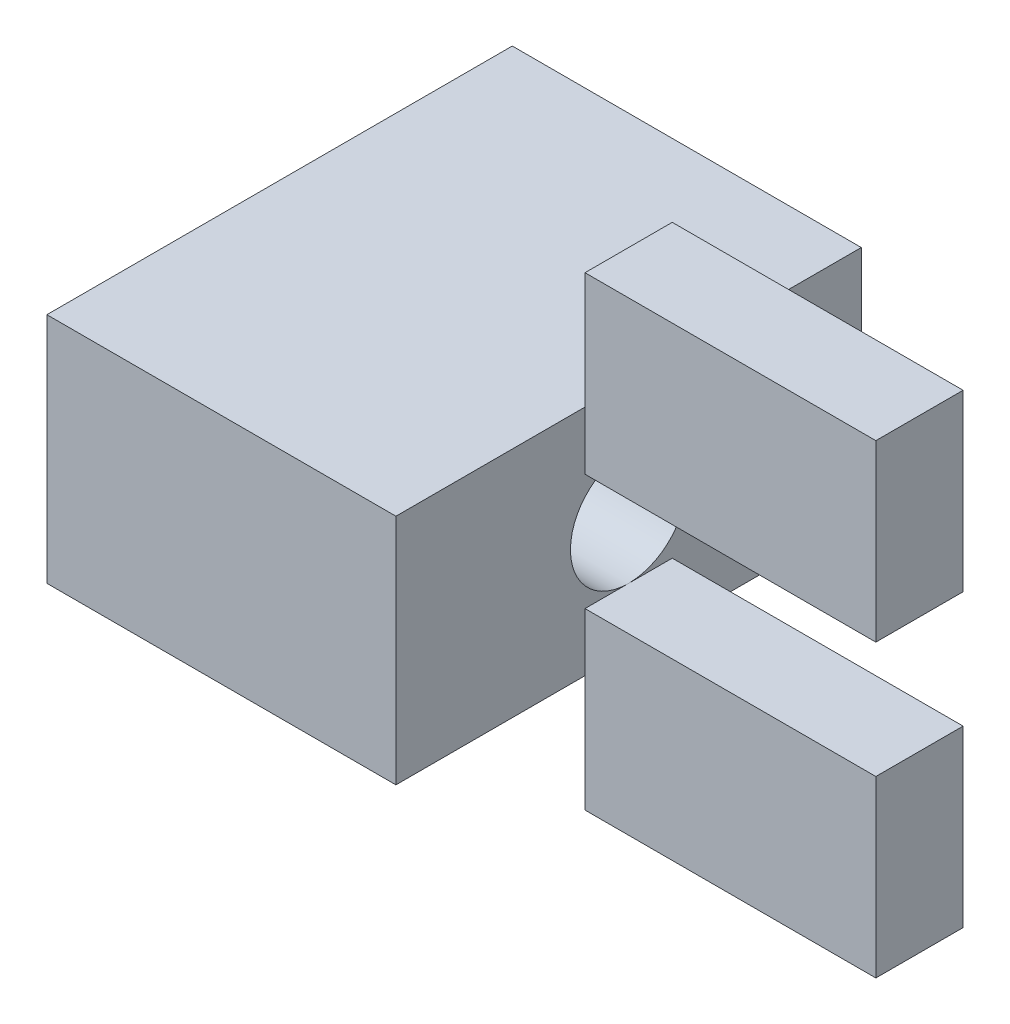
ISO-10303-21;
HEADER;
FILE_DESCRIPTION(('STEP AP214'),'2;1');
FILE_NAME('part.step','',(''),(''),'','','');
FILE_SCHEMA(('AUTOMOTIVE_DESIGN { 1 0 10303 214 1 1 1 1 }'));
ENDSEC;
DATA;
#1=APPLICATION_CONTEXT('core data for automotive mechanical design processes');
#2=APPLICATION_PROTOCOL_DEFINITION('international standard','automotive_design',2000,#1);
#3=PRODUCT_CONTEXT('',#1,'mechanical');
#4=PRODUCT('Part','Part','',(#3));
#5=PRODUCT_RELATED_PRODUCT_CATEGORY('part','',(#4));
#6=PRODUCT_DEFINITION_FORMATION('','',#4);
#7=PRODUCT_DEFINITION_CONTEXT('part definition',#1,'design');
#8=PRODUCT_DEFINITION('design','',#6,#7);
#9=PRODUCT_DEFINITION_SHAPE('','',#8);
#10=(LENGTH_UNIT() NAMED_UNIT(*) SI_UNIT(.MILLI.,.METRE.));
#11=(NAMED_UNIT(*) PLANE_ANGLE_UNIT() SI_UNIT($,.RADIAN.));
#12=(NAMED_UNIT(*) SI_UNIT($,.STERADIAN.) SOLID_ANGLE_UNIT());
#13=UNCERTAINTY_MEASURE_WITH_UNIT(LENGTH_MEASURE(1.E-05),#10,'distance_accuracy_value','');
#14=(GEOMETRIC_REPRESENTATION_CONTEXT(3) GLOBAL_UNCERTAINTY_ASSIGNED_CONTEXT((#13)) GLOBAL_UNIT_ASSIGNED_CONTEXT((#10,
#11,#12)) REPRESENTATION_CONTEXT('',''));
#15=CARTESIAN_POINT('',(0.,0.,0.));
#16=DIRECTION('',(0.,0.,1.));
#17=DIRECTION('',(1.,0.,0.));
#18=AXIS2_PLACEMENT_3D('',#15,#16,#17);
#19=CARTESIAN_POINT('',(60.,0.,0.));
#20=DIRECTION('',(-1.,0.,0.));
#21=DIRECTION('',(0.,0.,1.));
#22=AXIS2_PLACEMENT_3D('',#19,#20,#21);
#23=PLANE('',#22);
#24=DIRECTION('',(0.,1.,0.));
#25=VECTOR('',#24,1.);
#26=CARTESIAN_POINT('',(60.,10.,-7.5));
#27=LINE('',#26,#25);
#28=CARTESIAN_POINT('',(60.,10.,-7.5));
#29=VERTEX_POINT('',#28);
#30=CARTESIAN_POINT('',(60.,20.,-7.5));
#31=VERTEX_POINT('',#30);
#32=EDGE_CURVE('E60',#29,#31,#27,.T.);
#33=ORIENTED_EDGE('',*,*,#32,.F.);
#34=DIRECTION('',(0.,0.,-1.));
#35=VECTOR('',#34,1.);
#36=CARTESIAN_POINT('',(60.,10.,7.5));
#37=LINE('',#36,#35);
#38=CARTESIAN_POINT('',(60.,10.,0.));
#39=VERTEX_POINT('',#38);
#40=EDGE_CURVE('E11',#39,#29,#37,.T.);
#41=ORIENTED_EDGE('',*,*,#40,.F.);
#42=CARTESIAN_POINT('',(60.,0.,0.));
#43=DIRECTION('',(1.,0.,0.));
#44=DIRECTION('',(0.,0.,-1.));
#45=AXIS2_PLACEMENT_3D('',#42,#43,#44);
#46=CIRCLE('',#45,10.);
#47=CARTESIAN_POINT('',(60.,-10.,0.));
#48=VERTEX_POINT('',#47);
#49=EDGE_CURVE('E178',#48,#39,#46,.T.);
#50=ORIENTED_EDGE('',*,*,#49,.F.);
#51=DIRECTION('',(0.,0.,1.));
#52=VECTOR('',#51,1.);
#53=CARTESIAN_POINT('',(60.,-10.,7.5));
#54=LINE('',#53,#52);
#55=CARTESIAN_POINT('',(60.,-10.,-7.5));
#56=VERTEX_POINT('',#55);
#57=EDGE_CURVE('E62',#56,#48,#54,.T.);
#58=ORIENTED_EDGE('',*,*,#57,.F.);
#59=DIRECTION('',(0.,1.,0.));
#60=VECTOR('',#59,1.);
#61=CARTESIAN_POINT('',(60.,-40.,-7.5));
#62=LINE('',#61,#60);
#63=CARTESIAN_POINT('',(60.,-20.,-7.5));
#64=VERTEX_POINT('',#63);
#65=EDGE_CURVE('E210',#64,#56,#62,.T.);
#66=ORIENTED_EDGE('',*,*,#65,.F.);
#67=DIRECTION('',(0.,0.,-1.));
#68=VECTOR('',#67,1.);
#69=CARTESIAN_POINT('',(60.,-20.,40.));
#70=LINE('',#69,#68);
#71=CARTESIAN_POINT('',(60.,-20.,-40.));
#72=VERTEX_POINT('',#71);
#73=EDGE_CURVE('E230',#64,#72,#70,.T.);
#74=ORIENTED_EDGE('',*,*,#73,.T.);
#75=DIRECTION('',(0.,1.,0.));
#76=VECTOR('',#75,1.);
#77=CARTESIAN_POINT('',(60.,-20.,-40.));
#78=LINE('',#77,#76);
#79=CARTESIAN_POINT('',(60.,20.,-40.));
#80=VERTEX_POINT('',#79);
#81=EDGE_CURVE('E218',#72,#80,#78,.T.);
#82=ORIENTED_EDGE('',*,*,#81,.T.);
#83=DIRECTION('',(0.,0.,1.));
#84=VECTOR('',#83,1.);
#85=CARTESIAN_POINT('',(60.,20.,40.));
#86=LINE('',#85,#84);
#87=EDGE_CURVE('E221',#80,#31,#86,.T.);
#88=ORIENTED_EDGE('',*,*,#87,.T.);
#89=EDGE_LOOP('',(#33,#41,#50,#58,#66,#74,#82,#88));
#90=FACE_BOUND('',#89,.T.);
#91=ADVANCED_FACE('F39',(#90),#23,.F.);
#92=CARTESIAN_POINT('',(60.,10.,7.5));
#93=VERTEX_POINT('',#92);
#94=EDGE_CURVE('E49',#93,#39,#37,.T.);
#95=ORIENTED_EDGE('',*,*,#94,.F.);
#96=DIRECTION('',(0.,-1.,0.));
#97=VECTOR('',#96,1.);
#98=CARTESIAN_POINT('',(60.,10.,7.5));
#99=LINE('',#98,#97);
#100=CARTESIAN_POINT('',(60.,20.,7.5));
#101=VERTEX_POINT('',#100);
#102=EDGE_CURVE('E48',#101,#93,#99,.T.);
#103=ORIENTED_EDGE('',*,*,#102,.F.);
#104=CARTESIAN_POINT('',(60.,20.,40.));
#105=VERTEX_POINT('',#104);
#106=EDGE_CURVE('E225',#101,#105,#86,.T.);
#107=ORIENTED_EDGE('',*,*,#106,.T.);
#108=DIRECTION('',(0.,-1.,0.));
#109=VECTOR('',#108,1.);
#110=CARTESIAN_POINT('',(60.,-20.,40.));
#111=LINE('',#110,#109);
#112=CARTESIAN_POINT('',(60.,-20.,40.));
#113=VERTEX_POINT('',#112);
#114=EDGE_CURVE('E228',#105,#113,#111,.T.);
#115=ORIENTED_EDGE('',*,*,#114,.T.);
#116=CARTESIAN_POINT('',(60.,-20.,7.5));
#117=VERTEX_POINT('',#116);
#118=EDGE_CURVE('E226',#113,#117,#70,.T.);
#119=ORIENTED_EDGE('',*,*,#118,.T.);
#120=DIRECTION('',(0.,-1.,0.));
#121=VECTOR('',#120,1.);
#122=CARTESIAN_POINT('',(60.,-40.,7.5));
#123=LINE('',#122,#121);
#124=CARTESIAN_POINT('',(60.,-10.,7.5));
#125=VERTEX_POINT('',#124);
#126=EDGE_CURVE('E200',#125,#117,#123,.T.);
#127=ORIENTED_EDGE('',*,*,#126,.F.);
#128=EDGE_CURVE('E204',#48,#125,#54,.T.);
#129=ORIENTED_EDGE('',*,*,#128,.F.);
#130=EDGE_CURVE('E214',#39,#48,#46,.T.);
#131=ORIENTED_EDGE('',*,*,#130,.F.);
#132=EDGE_LOOP('',(#95,#103,#107,#115,#119,#127,#129,#131));
#133=FACE_BOUND('',#132,.T.);
#134=ADVANCED_FACE('F281',(#133),#23,.F.);
#135=CARTESIAN_POINT('',(60.,-20.,-40.));
#136=DIRECTION('',(0.,0.,1.));
#137=DIRECTION('',(1.,0.,0.));
#138=AXIS2_PLACEMENT_3D('',#135,#136,#137);
#139=PLANE('',#138);
#140=DIRECTION('',(0.,1.,0.));
#141=VECTOR('',#140,1.);
#142=CARTESIAN_POINT('',(0.,-20.,-40.));
#143=LINE('',#142,#141);
#144=CARTESIAN_POINT('',(0.,-20.,-40.));
#145=VERTEX_POINT('',#144);
#146=CARTESIAN_POINT('',(0.,20.,-40.));
#147=VERTEX_POINT('',#146);
#148=EDGE_CURVE('E220',#145,#147,#143,.T.);
#149=ORIENTED_EDGE('',*,*,#148,.T.);
#150=DIRECTION('',(-1.,0.,0.));
#151=VECTOR('',#150,1.);
#152=CARTESIAN_POINT('',(60.,20.,-40.));
#153=LINE('',#152,#151);
#154=EDGE_CURVE('E43',#80,#147,#153,.T.);
#155=ORIENTED_EDGE('',*,*,#154,.F.);
#156=ORIENTED_EDGE('',*,*,#81,.F.);
#157=DIRECTION('',(-1.,0.,0.));
#158=VECTOR('',#157,1.);
#159=CARTESIAN_POINT('',(60.,-20.,-40.));
#160=LINE('',#159,#158);
#161=EDGE_CURVE('E232',#72,#145,#160,.T.);
#162=ORIENTED_EDGE('',*,*,#161,.T.);
#163=EDGE_LOOP('',(#149,#155,#156,#162));
#164=FACE_BOUND('',#163,.T.);
#165=ADVANCED_FACE('F41',(#164),#139,.F.);
#166=CARTESIAN_POINT('',(60.,20.,40.));
#167=DIRECTION('',(0.,-1.,0.));
#168=DIRECTION('',(0.,0.,-1.));
#169=AXIS2_PLACEMENT_3D('',#166,#167,#168);
#170=PLANE('',#169);
#171=DIRECTION('',(0.,0.,1.));
#172=VECTOR('',#171,1.);
#173=CARTESIAN_POINT('',(0.,20.,40.));
#174=LINE('',#173,#172);
#175=CARTESIAN_POINT('',(0.,20.,40.));
#176=VERTEX_POINT('',#175);
#177=EDGE_CURVE('E240',#147,#176,#174,.T.);
#178=ORIENTED_EDGE('',*,*,#177,.T.);
#179=DIRECTION('',(-1.,0.,0.));
#180=VECTOR('',#179,1.);
#181=CARTESIAN_POINT('',(60.,20.,40.));
#182=LINE('',#181,#180);
#183=EDGE_CURVE('E248',#105,#176,#182,.T.);
#184=ORIENTED_EDGE('',*,*,#183,.F.);
#185=ORIENTED_EDGE('',*,*,#106,.F.);
#186=EDGE_CURVE('E229',#31,#101,#86,.T.);
#187=ORIENTED_EDGE('',*,*,#186,.F.);
#188=ORIENTED_EDGE('',*,*,#87,.F.);
#189=ORIENTED_EDGE('',*,*,#154,.T.);
#190=EDGE_LOOP('',(#178,#184,#185,#187,#188,#189));
#191=FACE_BOUND('',#190,.T.);
#192=ADVANCED_FACE('F326',(#191),#170,.F.);
#193=CARTESIAN_POINT('',(60.,-20.,40.));
#194=DIRECTION('',(0.,0.,-1.));
#195=DIRECTION('',(-1.,0.,0.));
#196=AXIS2_PLACEMENT_3D('',#193,#194,#195);
#197=PLANE('',#196);
#198=DIRECTION('',(0.,-1.,0.));
#199=VECTOR('',#198,1.);
#200=CARTESIAN_POINT('',(0.,-20.,40.));
#201=LINE('',#200,#199);
#202=CARTESIAN_POINT('',(0.,-20.,40.));
#203=VERTEX_POINT('',#202);
#204=EDGE_CURVE('E239',#176,#203,#201,.T.);
#205=ORIENTED_EDGE('',*,*,#204,.T.);
#206=DIRECTION('',(-1.,0.,0.));
#207=VECTOR('',#206,1.);
#208=CARTESIAN_POINT('',(60.,-20.,40.));
#209=LINE('',#208,#207);
#210=EDGE_CURVE('E245',#113,#203,#209,.T.);
#211=ORIENTED_EDGE('',*,*,#210,.F.);
#212=ORIENTED_EDGE('',*,*,#114,.F.);
#213=ORIENTED_EDGE('',*,*,#183,.T.);
#214=EDGE_LOOP('',(#205,#211,#212,#213));
#215=FACE_BOUND('',#214,.T.);
#216=ADVANCED_FACE('F323',(#215),#197,.F.);
#217=CARTESIAN_POINT('',(60.,-20.,40.));
#218=DIRECTION('',(0.,1.,0.));
#219=DIRECTION('',(0.,0.,1.));
#220=AXIS2_PLACEMENT_3D('',#217,#218,#219);
#221=PLANE('',#220);
#222=DIRECTION('',(0.,0.,-1.));
#223=VECTOR('',#222,1.);
#224=CARTESIAN_POINT('',(0.,-20.,40.));
#225=LINE('',#224,#223);
#226=EDGE_CURVE('E224',#203,#145,#225,.T.);
#227=ORIENTED_EDGE('',*,*,#226,.T.);
#228=ORIENTED_EDGE('',*,*,#161,.F.);
#229=ORIENTED_EDGE('',*,*,#73,.F.);
#230=EDGE_CURVE('E235',#117,#64,#70,.T.);
#231=ORIENTED_EDGE('',*,*,#230,.F.);
#232=ORIENTED_EDGE('',*,*,#118,.F.);
#233=ORIENTED_EDGE('',*,*,#210,.T.);
#234=EDGE_LOOP('',(#227,#228,#229,#231,#232,#233));
#235=FACE_BOUND('',#234,.T.);
#236=ADVANCED_FACE('F317',(#235),#221,.F.);
#237=CARTESIAN_POINT('',(0.,0.,0.));
#238=DIRECTION('',(-1.,0.,0.));
#239=DIRECTION('',(0.,0.,1.));
#240=AXIS2_PLACEMENT_3D('',#237,#238,#239);
#241=PLANE('',#240);
#242=CARTESIAN_POINT('',(0.,0.,0.));
#243=DIRECTION('',(1.,0.,0.));
#244=DIRECTION('',(0.,0.,-1.));
#245=AXIS2_PLACEMENT_3D('',#242,#243,#244);
#246=CIRCLE('',#245,10.);
#247=CARTESIAN_POINT('',(0.,0.,-10.));
#248=VERTEX_POINT('',#247);
#249=EDGE_CURVE('E172',#248,#248,#246,.T.);
#250=ORIENTED_EDGE('',*,*,#249,.T.);
#251=EDGE_LOOP('',(#250));
#252=FACE_BOUND('',#251,.T.);
#253=ORIENTED_EDGE('',*,*,#148,.F.);
#254=ORIENTED_EDGE('',*,*,#226,.F.);
#255=ORIENTED_EDGE('',*,*,#204,.F.);
#256=ORIENTED_EDGE('',*,*,#177,.F.);
#257=EDGE_LOOP('',(#253,#254,#255,#256));
#258=FACE_BOUND('',#257,.T.);
#259=ADVANCED_FACE('F307',(#252,#258),#241,.T.);
#260=CARTESIAN_POINT('',(60.,0.,0.));
#261=DIRECTION('',(-1.,0.,0.));
#262=DIRECTION('',(0.,0.,1.));
#263=AXIS2_PLACEMENT_3D('',#260,#261,#262);
#264=CYLINDRICAL_SURFACE('',#263,10.);
#265=ORIENTED_EDGE('',*,*,#130,.T.);
#266=ORIENTED_EDGE('',*,*,#49,.T.);
#267=EDGE_LOOP('',(#265,#266));
#268=FACE_BOUND('',#267,.T.);
#269=ORIENTED_EDGE('',*,*,#249,.F.);
#270=EDGE_LOOP('',(#269));
#271=FACE_BOUND('',#270,.T.);
#272=ADVANCED_FACE('F284',(#268,#271),#264,.F.);
#273=CARTESIAN_POINT('',(110.,-40.,-7.5));
#274=DIRECTION('',(0.,0.,1.));
#275=DIRECTION('',(1.,0.,0.));
#276=AXIS2_PLACEMENT_3D('',#273,#274,#275);
#277=PLANE('',#276);
#278=CARTESIAN_POINT('',(60.,-40.,-7.5));
#279=VERTEX_POINT('',#278);
#280=EDGE_CURVE('E201',#279,#64,#62,.T.);
#281=ORIENTED_EDGE('',*,*,#280,.T.);
#282=ORIENTED_EDGE('',*,*,#65,.T.);
#283=DIRECTION('',(-1.,0.,0.));
#284=VECTOR('',#283,1.);
#285=CARTESIAN_POINT('',(110.,-10.,-7.5));
#286=LINE('',#285,#284);
#287=CARTESIAN_POINT('',(110.,-10.,-7.5));
#288=VERTEX_POINT('',#287);
#289=EDGE_CURVE('E185',#288,#56,#286,.T.);
#290=ORIENTED_EDGE('',*,*,#289,.F.);
#291=DIRECTION('',(0.,1.,0.));
#292=VECTOR('',#291,1.);
#293=CARTESIAN_POINT('',(110.,-40.,-7.5));
#294=LINE('',#293,#292);
#295=CARTESIAN_POINT('',(110.,-40.,-7.5));
#296=VERTEX_POINT('',#295);
#297=EDGE_CURVE('E196',#296,#288,#294,.T.);
#298=ORIENTED_EDGE('',*,*,#297,.F.);
#299=DIRECTION('',(-1.,0.,0.));
#300=VECTOR('',#299,1.);
#301=CARTESIAN_POINT('',(110.,-40.,-7.5));
#302=LINE('',#301,#300);
#303=EDGE_CURVE('E193',#296,#279,#302,.T.);
#304=ORIENTED_EDGE('',*,*,#303,.T.);
#305=EDGE_LOOP('',(#281,#282,#290,#298,#304));
#306=FACE_BOUND('',#305,.T.);
#307=ADVANCED_FACE('F297',(#306),#277,.F.);
#308=CARTESIAN_POINT('',(110.,-10.,7.5));
#309=DIRECTION('',(0.,-1.,0.));
#310=DIRECTION('',(0.,0.,-1.));
#311=AXIS2_PLACEMENT_3D('',#308,#309,#310);
#312=PLANE('',#311);
#313=ORIENTED_EDGE('',*,*,#57,.T.);
#314=ORIENTED_EDGE('',*,*,#128,.T.);
#315=DIRECTION('',(-1.,0.,0.));
#316=VECTOR('',#315,1.);
#317=CARTESIAN_POINT('',(110.,-10.,7.5));
#318=LINE('',#317,#316);
#319=CARTESIAN_POINT('',(110.,-10.,7.5));
#320=VERTEX_POINT('',#319);
#321=EDGE_CURVE('E183',#320,#125,#318,.T.);
#322=ORIENTED_EDGE('',*,*,#321,.F.);
#323=DIRECTION('',(0.,0.,1.));
#324=VECTOR('',#323,1.);
#325=CARTESIAN_POINT('',(110.,-10.,7.5));
#326=LINE('',#325,#324);
#327=EDGE_CURVE('E211',#288,#320,#326,.T.);
#328=ORIENTED_EDGE('',*,*,#327,.F.);
#329=ORIENTED_EDGE('',*,*,#289,.T.);
#330=EDGE_LOOP('',(#313,#314,#322,#328,#329));
#331=FACE_BOUND('',#330,.T.);
#332=ADVANCED_FACE('F295',(#331),#312,.F.);
#333=CARTESIAN_POINT('',(110.,-40.,7.5));
#334=DIRECTION('',(0.,0.,-1.));
#335=DIRECTION('',(-1.,0.,0.));
#336=AXIS2_PLACEMENT_3D('',#333,#334,#335);
#337=PLANE('',#336);
#338=ORIENTED_EDGE('',*,*,#126,.T.);
#339=CARTESIAN_POINT('',(60.,-40.,7.5));
#340=VERTEX_POINT('',#339);
#341=EDGE_CURVE('E197',#117,#340,#123,.T.);
#342=ORIENTED_EDGE('',*,*,#341,.T.);
#343=DIRECTION('',(-1.,0.,0.));
#344=VECTOR('',#343,1.);
#345=CARTESIAN_POINT('',(110.,-40.,7.5));
#346=LINE('',#345,#344);
#347=CARTESIAN_POINT('',(110.,-40.,7.5));
#348=VERTEX_POINT('',#347);
#349=EDGE_CURVE('E187',#348,#340,#346,.T.);
#350=ORIENTED_EDGE('',*,*,#349,.F.);
#351=DIRECTION('',(0.,-1.,0.));
#352=VECTOR('',#351,1.);
#353=CARTESIAN_POINT('',(110.,-40.,7.5));
#354=LINE('',#353,#352);
#355=EDGE_CURVE('E207',#320,#348,#354,.T.);
#356=ORIENTED_EDGE('',*,*,#355,.F.);
#357=ORIENTED_EDGE('',*,*,#321,.T.);
#358=EDGE_LOOP('',(#338,#342,#350,#356,#357));
#359=FACE_BOUND('',#358,.T.);
#360=ADVANCED_FACE('F290',(#359),#337,.F.);
#361=CARTESIAN_POINT('',(110.,-40.,7.5));
#362=DIRECTION('',(0.,1.,0.));
#363=DIRECTION('',(0.,0.,1.));
#364=AXIS2_PLACEMENT_3D('',#361,#362,#363);
#365=PLANE('',#364);
#366=DIRECTION('',(0.,0.,-1.));
#367=VECTOR('',#366,1.);
#368=CARTESIAN_POINT('',(60.,-40.,7.5));
#369=LINE('',#368,#367);
#370=EDGE_CURVE('E191',#340,#279,#369,.T.);
#371=ORIENTED_EDGE('',*,*,#370,.T.);
#372=ORIENTED_EDGE('',*,*,#303,.F.);
#373=DIRECTION('',(0.,0.,-1.));
#374=VECTOR('',#373,1.);
#375=CARTESIAN_POINT('',(110.,-40.,7.5));
#376=LINE('',#375,#374);
#377=EDGE_CURVE('E195',#348,#296,#376,.T.);
#378=ORIENTED_EDGE('',*,*,#377,.F.);
#379=ORIENTED_EDGE('',*,*,#349,.T.);
#380=EDGE_LOOP('',(#371,#372,#378,#379));
#381=FACE_BOUND('',#380,.T.);
#382=ADVANCED_FACE('F368',(#381),#365,.F.);
#383=CARTESIAN_POINT('',(110.,0.,0.));
#384=DIRECTION('',(-1.,0.,0.));
#385=DIRECTION('',(0.,0.,1.));
#386=AXIS2_PLACEMENT_3D('',#383,#384,#385);
#387=PLANE('',#386);
#388=ORIENTED_EDGE('',*,*,#297,.T.);
#389=ORIENTED_EDGE('',*,*,#327,.T.);
#390=ORIENTED_EDGE('',*,*,#355,.T.);
#391=ORIENTED_EDGE('',*,*,#377,.T.);
#392=EDGE_LOOP('',(#388,#389,#390,#391));
#393=FACE_BOUND('',#392,.T.);
#394=ADVANCED_FACE('F293',(#393),#387,.F.);
#395=CARTESIAN_POINT('',(60.,0.,0.));
#396=DIRECTION('',(-1.,0.,0.));
#397=DIRECTION('',(0.,0.,1.));
#398=AXIS2_PLACEMENT_3D('',#395,#396,#397);
#399=PLANE('',#398);
#400=ORIENTED_EDGE('',*,*,#341,.F.);
#401=ORIENTED_EDGE('',*,*,#230,.T.);
#402=ORIENTED_EDGE('',*,*,#280,.F.);
#403=ORIENTED_EDGE('',*,*,#370,.F.);
#404=EDGE_LOOP('',(#400,#401,#402,#403));
#405=FACE_BOUND('',#404,.T.);
#406=ADVANCED_FACE('F357',(#405),#399,.T.);
#407=CARTESIAN_POINT('',(110.,10.,-7.5));
#408=DIRECTION('',(0.,0.,1.));
#409=DIRECTION('',(1.,0.,0.));
#410=AXIS2_PLACEMENT_3D('',#407,#408,#409);
#411=PLANE('',#410);
#412=ORIENTED_EDGE('',*,*,#32,.T.);
#413=CARTESIAN_POINT('',(60.,40.,-7.5));
#414=VERTEX_POINT('',#413);
#415=EDGE_CURVE('E173',#31,#414,#27,.T.);
#416=ORIENTED_EDGE('',*,*,#415,.T.);
#417=DIRECTION('',(-1.,0.,0.));
#418=VECTOR('',#417,1.);
#419=CARTESIAN_POINT('',(110.,40.,-7.5));
#420=LINE('',#419,#418);
#421=CARTESIAN_POINT('',(110.,40.,-7.5));
#422=VERTEX_POINT('',#421);
#423=EDGE_CURVE('E153',#422,#414,#420,.T.);
#424=ORIENTED_EDGE('',*,*,#423,.F.);
#425=DIRECTION('',(0.,1.,0.));
#426=VECTOR('',#425,1.);
#427=CARTESIAN_POINT('',(110.,10.,-7.5));
#428=LINE('',#427,#426);
#429=CARTESIAN_POINT('',(110.,10.,-7.5));
#430=VERTEX_POINT('',#429);
#431=EDGE_CURVE('E157',#430,#422,#428,.T.);
#432=ORIENTED_EDGE('',*,*,#431,.F.);
#433=DIRECTION('',(-1.,0.,0.));
#434=VECTOR('',#433,1.);
#435=CARTESIAN_POINT('',(110.,10.,-7.5));
#436=LINE('',#435,#434);
#437=EDGE_CURVE('E273',#430,#29,#436,.T.);
#438=ORIENTED_EDGE('',*,*,#437,.T.);
#439=EDGE_LOOP('',(#412,#416,#424,#432,#438));
#440=FACE_BOUND('',#439,.T.);
#441=ADVANCED_FACE('F166',(#440),#411,.F.);
#442=CARTESIAN_POINT('',(110.,40.,7.5));
#443=DIRECTION('',(0.,-1.,0.));
#444=DIRECTION('',(0.,0.,-1.));
#445=AXIS2_PLACEMENT_3D('',#442,#443,#444);
#446=PLANE('',#445);
#447=DIRECTION('',(0.,0.,1.));
#448=VECTOR('',#447,1.);
#449=CARTESIAN_POINT('',(60.,40.,7.5));
#450=LINE('',#449,#448);
#451=CARTESIAN_POINT('',(60.,40.,7.5));
#452=VERTEX_POINT('',#451);
#453=EDGE_CURVE('E268',#414,#452,#450,.T.);
#454=ORIENTED_EDGE('',*,*,#453,.T.);
#455=DIRECTION('',(-1.,0.,0.));
#456=VECTOR('',#455,1.);
#457=CARTESIAN_POINT('',(110.,40.,7.5));
#458=LINE('',#457,#456);
#459=CARTESIAN_POINT('',(110.,40.,7.5));
#460=VERTEX_POINT('',#459);
#461=EDGE_CURVE('E154',#460,#452,#458,.T.);
#462=ORIENTED_EDGE('',*,*,#461,.F.);
#463=DIRECTION('',(0.,0.,1.));
#464=VECTOR('',#463,1.);
#465=CARTESIAN_POINT('',(110.,40.,7.5));
#466=LINE('',#465,#464);
#467=EDGE_CURVE('E149',#422,#460,#466,.T.);
#468=ORIENTED_EDGE('',*,*,#467,.F.);
#469=ORIENTED_EDGE('',*,*,#423,.T.);
#470=EDGE_LOOP('',(#454,#462,#468,#469));
#471=FACE_BOUND('',#470,.T.);
#472=ADVANCED_FACE('F151',(#471),#446,.F.);
#473=CARTESIAN_POINT('',(110.,10.,7.5));
#474=DIRECTION('',(0.,0.,-1.));
#475=DIRECTION('',(-1.,0.,0.));
#476=AXIS2_PLACEMENT_3D('',#473,#474,#475);
#477=PLANE('',#476);
#478=EDGE_CURVE('E265',#452,#101,#99,.T.);
#479=ORIENTED_EDGE('',*,*,#478,.T.);
#480=ORIENTED_EDGE('',*,*,#102,.T.);
#481=DIRECTION('',(-1.,0.,0.));
#482=VECTOR('',#481,1.);
#483=CARTESIAN_POINT('',(110.,10.,7.5));
#484=LINE('',#483,#482);
#485=CARTESIAN_POINT('',(110.,10.,7.5));
#486=VERTEX_POINT('',#485);
#487=EDGE_CURVE('E177',#486,#93,#484,.T.);
#488=ORIENTED_EDGE('',*,*,#487,.F.);
#489=DIRECTION('',(0.,-1.,0.));
#490=VECTOR('',#489,1.);
#491=CARTESIAN_POINT('',(110.,10.,7.5));
#492=LINE('',#491,#490);
#493=EDGE_CURVE('E158',#460,#486,#492,.T.);
#494=ORIENTED_EDGE('',*,*,#493,.F.);
#495=ORIENTED_EDGE('',*,*,#461,.T.);
#496=EDGE_LOOP('',(#479,#480,#488,#494,#495));
#497=FACE_BOUND('',#496,.T.);
#498=ADVANCED_FACE('F274',(#497),#477,.F.);
#499=CARTESIAN_POINT('',(110.,10.,7.5));
#500=DIRECTION('',(0.,1.,0.));
#501=DIRECTION('',(0.,0.,1.));
#502=AXIS2_PLACEMENT_3D('',#499,#500,#501);
#503=PLANE('',#502);
#504=ORIENTED_EDGE('',*,*,#94,.T.);
#505=ORIENTED_EDGE('',*,*,#40,.T.);
#506=ORIENTED_EDGE('',*,*,#437,.F.);
#507=DIRECTION('',(0.,0.,-1.));
#508=VECTOR('',#507,1.);
#509=CARTESIAN_POINT('',(110.,10.,7.5));
#510=LINE('',#509,#508);
#511=EDGE_CURVE('E163',#486,#430,#510,.T.);
#512=ORIENTED_EDGE('',*,*,#511,.F.);
#513=ORIENTED_EDGE('',*,*,#487,.T.);
#514=EDGE_LOOP('',(#504,#505,#506,#512,#513));
#515=FACE_BOUND('',#514,.T.);
#516=ADVANCED_FACE('F280',(#515),#503,.F.);
#517=CARTESIAN_POINT('',(110.,0.,0.));
#518=DIRECTION('',(-1.,0.,0.));
#519=DIRECTION('',(0.,0.,1.));
#520=AXIS2_PLACEMENT_3D('',#517,#518,#519);
#521=PLANE('',#520);
#522=ORIENTED_EDGE('',*,*,#431,.T.);
#523=ORIENTED_EDGE('',*,*,#467,.T.);
#524=ORIENTED_EDGE('',*,*,#493,.T.);
#525=ORIENTED_EDGE('',*,*,#511,.T.);
#526=EDGE_LOOP('',(#522,#523,#524,#525));
#527=FACE_BOUND('',#526,.T.);
#528=ADVANCED_FACE('F165',(#527),#521,.F.);
#529=CARTESIAN_POINT('',(60.,0.,0.));
#530=DIRECTION('',(-1.,0.,0.));
#531=DIRECTION('',(0.,0.,1.));
#532=AXIS2_PLACEMENT_3D('',#529,#530,#531);
#533=PLANE('',#532);
#534=ORIENTED_EDGE('',*,*,#415,.F.);
#535=ORIENTED_EDGE('',*,*,#186,.T.);
#536=ORIENTED_EDGE('',*,*,#478,.F.);
#537=ORIENTED_EDGE('',*,*,#453,.F.);
#538=EDGE_LOOP('',(#534,#535,#536,#537));
#539=FACE_BOUND('',#538,.T.);
#540=ADVANCED_FACE('F345',(#539),#533,.T.);
#541=CLOSED_SHELL('',(#91,#134,#165,#192,#216,#236,#259,#272,#307,#332,#360,#382,#394,#406,#441,
#472,#498,#516,#528,#540));
#542=MANIFOLD_SOLID_BREP('B2',#541);
#543=ADVANCED_BREP_SHAPE_REPRESENTATION('',(#18,#542),#14);
#544=SHAPE_DEFINITION_REPRESENTATION(#9,#543);
ENDSEC;
END-ISO-10303-21;
